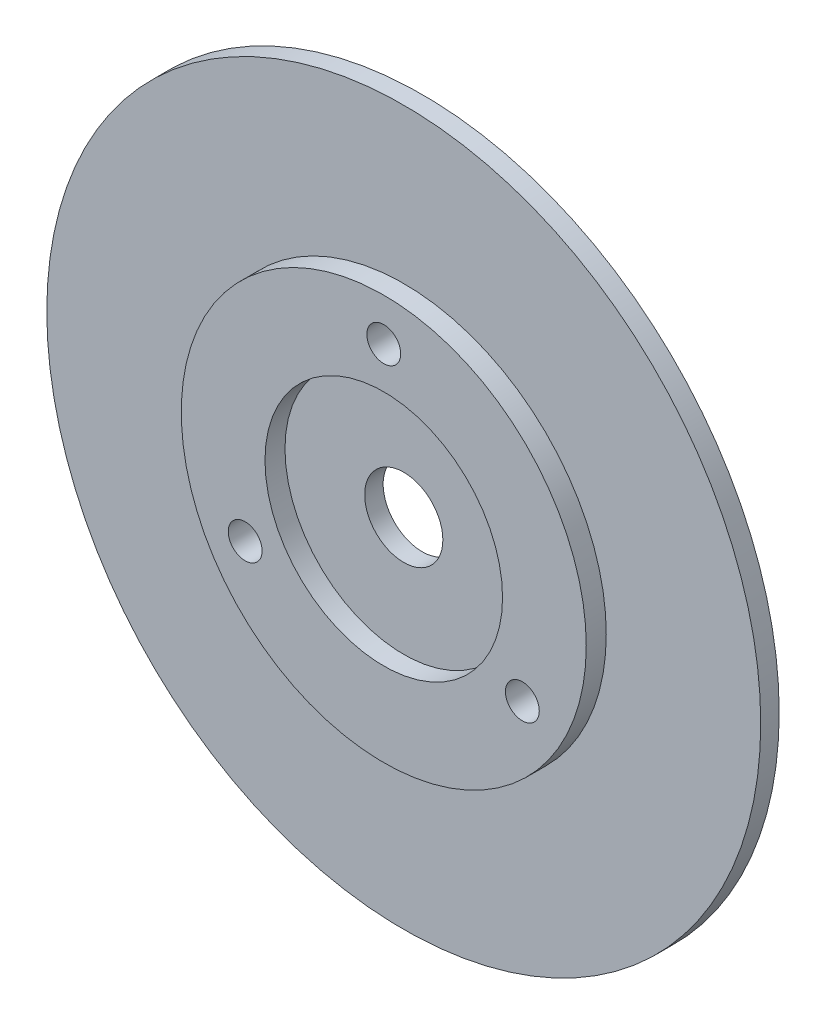
ISO-10303-21;
HEADER;
FILE_DESCRIPTION(('STEP AP214'),'2;1');
FILE_NAME('part.step','',(''),(''),'','','');
FILE_SCHEMA(('AUTOMOTIVE_DESIGN { 1 0 10303 214 1 1 1 1 }'));
ENDSEC;
DATA;
#1=APPLICATION_CONTEXT('core data for automotive mechanical design processes');
#2=APPLICATION_PROTOCOL_DEFINITION('international standard','automotive_design',2000,#1);
#3=PRODUCT_CONTEXT('',#1,'mechanical');
#4=PRODUCT('Part','Part','',(#3));
#5=PRODUCT_RELATED_PRODUCT_CATEGORY('part','',(#4));
#6=PRODUCT_DEFINITION_FORMATION('','',#4);
#7=PRODUCT_DEFINITION_CONTEXT('part definition',#1,'design');
#8=PRODUCT_DEFINITION('design','',#6,#7);
#9=PRODUCT_DEFINITION_SHAPE('','',#8);
#10=(LENGTH_UNIT() NAMED_UNIT(*) SI_UNIT(.MILLI.,.METRE.));
#11=(NAMED_UNIT(*) PLANE_ANGLE_UNIT() SI_UNIT($,.RADIAN.));
#12=(NAMED_UNIT(*) SI_UNIT($,.STERADIAN.) SOLID_ANGLE_UNIT());
#13=UNCERTAINTY_MEASURE_WITH_UNIT(LENGTH_MEASURE(1.E-05),#10,'distance_accuracy_value','');
#14=(GEOMETRIC_REPRESENTATION_CONTEXT(3) GLOBAL_UNCERTAINTY_ASSIGNED_CONTEXT((#13)) GLOBAL_UNIT_ASSIGNED_CONTEXT((#10,
#11,#12)) REPRESENTATION_CONTEXT('',''));
#15=CARTESIAN_POINT('',(0.,0.,0.));
#16=DIRECTION('',(0.,0.,1.));
#17=DIRECTION('',(1.,0.,0.));
#18=AXIS2_PLACEMENT_3D('',#15,#16,#17);
#19=CARTESIAN_POINT('',(0.,0.,0.));
#20=DIRECTION('',(0.,0.,1.));
#21=DIRECTION('',(1.,0.,0.));
#22=AXIS2_PLACEMENT_3D('',#19,#20,#21);
#23=CYLINDRICAL_SURFACE('',#22,6.35);
#24=CARTESIAN_POINT('',(0.,0.,0.));
#25=DIRECTION('',(0.,0.,1.));
#26=DIRECTION('',(1.,0.,0.));
#27=AXIS2_PLACEMENT_3D('',#24,#25,#26);
#28=CIRCLE('',#27,6.35);
#29=CARTESIAN_POINT('',(6.35,0.,0.));
#30=VERTEX_POINT('',#29);
#31=EDGE_CURVE('E69',#30,#30,#28,.T.);
#32=ORIENTED_EDGE('',*,*,#31,.T.);
#33=EDGE_LOOP('',(#32));
#34=FACE_BOUND('',#33,.T.);
#35=CARTESIAN_POINT('',(0.,0.,-3.));
#36=DIRECTION('',(0.,0.,1.));
#37=DIRECTION('',(1.,0.,0.));
#38=AXIS2_PLACEMENT_3D('',#35,#36,#37);
#39=CIRCLE('',#38,6.35);
#40=CARTESIAN_POINT('',(6.35,0.,-3.));
#41=VERTEX_POINT('',#40);
#42=EDGE_CURVE('E10',#41,#41,#39,.T.);
#43=ORIENTED_EDGE('',*,*,#42,.F.);
#44=EDGE_LOOP('',(#43));
#45=FACE_BOUND('',#44,.T.);
#46=ADVANCED_FACE('F41',(#34,#45),#23,.F.);
#47=CARTESIAN_POINT('',(6.35,0.,-3.));
#48=DIRECTION('',(0.,0.,-1.));
#49=DIRECTION('',(-1.,0.,0.));
#50=AXIS2_PLACEMENT_3D('',#47,#48,#49);
#51=PLANE('',#50);
#52=CARTESIAN_POINT('',(0.,26.,-3.));
#53=DIRECTION('',(0.,0.,1.));
#54=DIRECTION('',(1.,0.,0.));
#55=AXIS2_PLACEMENT_3D('',#52,#53,#54);
#56=CIRCLE('',#55,2.75);
#57=CARTESIAN_POINT('',(2.75,26.,-3.));
#58=VERTEX_POINT('',#57);
#59=EDGE_CURVE('E84',#58,#58,#56,.T.);
#60=ORIENTED_EDGE('',*,*,#59,.T.);
#61=EDGE_LOOP('',(#60));
#62=FACE_BOUND('',#61,.T.);
#63=CARTESIAN_POINT('',(-22.5166604983954,-13.,-3.));
#64=DIRECTION('',(0.,0.,1.));
#65=DIRECTION('',(1.,0.,0.));
#66=AXIS2_PLACEMENT_3D('',#63,#64,#65);
#67=CIRCLE('',#66,2.75);
#68=CARTESIAN_POINT('',(-19.7666604983954,-13.,-3.));
#69=VERTEX_POINT('',#68);
#70=EDGE_CURVE('E78',#69,#69,#67,.T.);
#71=ORIENTED_EDGE('',*,*,#70,.T.);
#72=EDGE_LOOP('',(#71));
#73=FACE_BOUND('',#72,.T.);
#74=CARTESIAN_POINT('',(22.5166604983954,-12.9999999999999,-3.));
#75=DIRECTION('',(0.,0.,1.));
#76=DIRECTION('',(1.,0.,0.));
#77=AXIS2_PLACEMENT_3D('',#74,#75,#76);
#78=CIRCLE('',#77,2.75);
#79=CARTESIAN_POINT('',(25.2666604983954,-12.9999999999999,-3.));
#80=VERTEX_POINT('',#79);
#81=EDGE_CURVE('E72',#80,#80,#78,.T.);
#82=ORIENTED_EDGE('',*,*,#81,.T.);
#83=EDGE_LOOP('',(#82));
#84=FACE_BOUND('',#83,.T.);
#85=ORIENTED_EDGE('',*,*,#42,.T.);
#86=EDGE_LOOP('',(#85));
#87=FACE_BOUND('',#86,.T.);
#88=CARTESIAN_POINT('',(0.,0.,-3.));
#89=DIRECTION('',(0.,0.,1.));
#90=DIRECTION('',(1.,0.,0.));
#91=AXIS2_PLACEMENT_3D('',#88,#89,#90);
#92=CIRCLE('',#91,58.);
#93=CARTESIAN_POINT('',(58.,0.,-3.));
#94=VERTEX_POINT('',#93);
#95=EDGE_CURVE('E47',#94,#94,#92,.T.);
#96=ORIENTED_EDGE('',*,*,#95,.F.);
#97=EDGE_LOOP('',(#96));
#98=FACE_BOUND('',#97,.T.);
#99=ADVANCED_FACE('F121',(#62,#73,#84,#87,#98),#51,.T.);
#100=CARTESIAN_POINT('',(0.,0.,0.));
#101=DIRECTION('',(0.,0.,1.));
#102=DIRECTION('',(1.,0.,0.));
#103=AXIS2_PLACEMENT_3D('',#100,#101,#102);
#104=CYLINDRICAL_SURFACE('',#103,58.);
#105=ORIENTED_EDGE('',*,*,#95,.T.);
#106=EDGE_LOOP('',(#105));
#107=FACE_BOUND('',#106,.T.);
#108=CARTESIAN_POINT('',(0.,0.,0.));
#109=DIRECTION('',(0.,0.,1.));
#110=DIRECTION('',(1.,0.,0.));
#111=AXIS2_PLACEMENT_3D('',#108,#109,#110);
#112=CIRCLE('',#111,58.);
#113=CARTESIAN_POINT('',(58.,0.,0.));
#114=VERTEX_POINT('',#113);
#115=EDGE_CURVE('E51',#114,#114,#112,.T.);
#116=ORIENTED_EDGE('',*,*,#115,.F.);
#117=EDGE_LOOP('',(#116));
#118=FACE_BOUND('',#117,.T.);
#119=ADVANCED_FACE('F126',(#107,#118),#104,.T.);
#120=CARTESIAN_POINT('',(32.9,0.,0.));
#121=DIRECTION('',(0.,0.,1.));
#122=DIRECTION('',(1.,0.,0.));
#123=AXIS2_PLACEMENT_3D('',#120,#121,#122);
#124=PLANE('',#123);
#125=ORIENTED_EDGE('',*,*,#115,.T.);
#126=EDGE_LOOP('',(#125));
#127=FACE_BOUND('',#126,.T.);
#128=CARTESIAN_POINT('',(0.,0.,0.));
#129=DIRECTION('',(0.,0.,1.));
#130=DIRECTION('',(1.,0.,0.));
#131=AXIS2_PLACEMENT_3D('',#128,#129,#130);
#132=CIRCLE('',#131,32.9);
#133=CARTESIAN_POINT('',(32.9,0.,0.));
#134=VERTEX_POINT('',#133);
#135=EDGE_CURVE('E55',#134,#134,#132,.T.);
#136=ORIENTED_EDGE('',*,*,#135,.F.);
#137=EDGE_LOOP('',(#136));
#138=FACE_BOUND('',#137,.T.);
#139=ADVANCED_FACE('F130',(#127,#138),#124,.T.);
#140=CARTESIAN_POINT('',(0.,0.,0.));
#141=DIRECTION('',(0.,0.,1.));
#142=DIRECTION('',(1.,0.,0.));
#143=AXIS2_PLACEMENT_3D('',#140,#141,#142);
#144=CYLINDRICAL_SURFACE('',#143,32.9);
#145=ORIENTED_EDGE('',*,*,#135,.T.);
#146=EDGE_LOOP('',(#145));
#147=FACE_BOUND('',#146,.T.);
#148=CARTESIAN_POINT('',(0.,0.,3.25));
#149=DIRECTION('',(0.,0.,1.));
#150=DIRECTION('',(1.,0.,0.));
#151=AXIS2_PLACEMENT_3D('',#148,#149,#150);
#152=CIRCLE('',#151,32.9);
#153=CARTESIAN_POINT('',(32.9,0.,3.25));
#154=VERTEX_POINT('',#153);
#155=EDGE_CURVE('E60',#154,#154,#152,.T.);
#156=ORIENTED_EDGE('',*,*,#155,.F.);
#157=EDGE_LOOP('',(#156));
#158=FACE_BOUND('',#157,.T.);
#159=ADVANCED_FACE('F97',(#147,#158),#144,.T.);
#160=CARTESIAN_POINT('',(19.3,0.,3.25));
#161=DIRECTION('',(0.,0.,1.));
#162=DIRECTION('',(1.,0.,0.));
#163=AXIS2_PLACEMENT_3D('',#160,#161,#162);
#164=PLANE('',#163);
#165=CARTESIAN_POINT('',(0.,26.,3.25));
#166=DIRECTION('',(0.,0.,1.));
#167=DIRECTION('',(1.,0.,0.));
#168=AXIS2_PLACEMENT_3D('',#165,#166,#167);
#169=CIRCLE('',#168,2.74999999999999);
#170=CARTESIAN_POINT('',(2.74999999999999,26.,3.25));
#171=VERTEX_POINT('',#170);
#172=EDGE_CURVE('E87',#171,#171,#169,.T.);
#173=ORIENTED_EDGE('',*,*,#172,.F.);
#174=EDGE_LOOP('',(#173));
#175=FACE_BOUND('',#174,.T.);
#176=CARTESIAN_POINT('',(-22.5166604983954,-13.,3.25));
#177=DIRECTION('',(0.,0.,1.));
#178=DIRECTION('',(1.,0.,0.));
#179=AXIS2_PLACEMENT_3D('',#176,#177,#178);
#180=CIRCLE('',#179,2.74999999999999);
#181=CARTESIAN_POINT('',(-19.7666604983954,-13.,3.25));
#182=VERTEX_POINT('',#181);
#183=EDGE_CURVE('E81',#182,#182,#180,.T.);
#184=ORIENTED_EDGE('',*,*,#183,.F.);
#185=EDGE_LOOP('',(#184));
#186=FACE_BOUND('',#185,.T.);
#187=CARTESIAN_POINT('',(22.5166604983954,-12.9999999999999,3.25));
#188=DIRECTION('',(0.,0.,1.));
#189=DIRECTION('',(1.,0.,0.));
#190=AXIS2_PLACEMENT_3D('',#187,#188,#189);
#191=CIRCLE('',#190,2.74999999999999);
#192=CARTESIAN_POINT('',(25.2666604983954,-12.9999999999999,3.25));
#193=VERTEX_POINT('',#192);
#194=EDGE_CURVE('E75',#193,#193,#191,.T.);
#195=ORIENTED_EDGE('',*,*,#194,.F.);
#196=EDGE_LOOP('',(#195));
#197=FACE_BOUND('',#196,.T.);
#198=ORIENTED_EDGE('',*,*,#155,.T.);
#199=EDGE_LOOP('',(#198));
#200=FACE_BOUND('',#199,.T.);
#201=CARTESIAN_POINT('',(0.,0.,3.25));
#202=DIRECTION('',(0.,0.,1.));
#203=DIRECTION('',(1.,0.,0.));
#204=AXIS2_PLACEMENT_3D('',#201,#202,#203);
#205=CIRCLE('',#204,19.3);
#206=CARTESIAN_POINT('',(19.3,0.,3.25));
#207=VERTEX_POINT('',#206);
#208=EDGE_CURVE('E63',#207,#207,#205,.T.);
#209=ORIENTED_EDGE('',*,*,#208,.F.);
#210=EDGE_LOOP('',(#209));
#211=FACE_BOUND('',#210,.T.);
#212=ADVANCED_FACE('F93',(#175,#186,#197,#200,#211),#164,.T.);
#213=CARTESIAN_POINT('',(0.,0.,0.));
#214=DIRECTION('',(0.,0.,1.));
#215=DIRECTION('',(1.,0.,0.));
#216=AXIS2_PLACEMENT_3D('',#213,#214,#215);
#217=CYLINDRICAL_SURFACE('',#216,19.3);
#218=ORIENTED_EDGE('',*,*,#208,.T.);
#219=EDGE_LOOP('',(#218));
#220=FACE_BOUND('',#219,.T.);
#221=CARTESIAN_POINT('',(0.,0.,0.));
#222=DIRECTION('',(0.,0.,1.));
#223=DIRECTION('',(1.,0.,0.));
#224=AXIS2_PLACEMENT_3D('',#221,#222,#223);
#225=CIRCLE('',#224,19.3);
#226=CARTESIAN_POINT('',(19.3,0.,0.));
#227=VERTEX_POINT('',#226);
#228=EDGE_CURVE('E66',#227,#227,#225,.T.);
#229=ORIENTED_EDGE('',*,*,#228,.F.);
#230=EDGE_LOOP('',(#229));
#231=FACE_BOUND('',#230,.T.);
#232=ADVANCED_FACE('F96',(#220,#231),#217,.F.);
#233=CARTESIAN_POINT('',(6.35,0.,0.));
#234=DIRECTION('',(0.,0.,1.));
#235=DIRECTION('',(1.,0.,0.));
#236=AXIS2_PLACEMENT_3D('',#233,#234,#235);
#237=PLANE('',#236);
#238=ORIENTED_EDGE('',*,*,#228,.T.);
#239=EDGE_LOOP('',(#238));
#240=FACE_BOUND('',#239,.T.);
#241=ORIENTED_EDGE('',*,*,#31,.F.);
#242=EDGE_LOOP('',(#241));
#243=FACE_BOUND('',#242,.T.);
#244=ADVANCED_FACE('F109',(#240,#243),#237,.T.);
#245=CARTESIAN_POINT('',(22.5166604983954,-12.9999999999999,3.25));
#246=DIRECTION('',(0.,0.,1.));
#247=DIRECTION('',(1.,0.,0.));
#248=AXIS2_PLACEMENT_3D('',#245,#246,#247);
#249=CYLINDRICAL_SURFACE('',#248,2.74999999999999);
#250=ORIENTED_EDGE('',*,*,#81,.F.);
#251=EDGE_LOOP('',(#250));
#252=FACE_BOUND('',#251,.T.);
#253=ORIENTED_EDGE('',*,*,#194,.T.);
#254=EDGE_LOOP('',(#253));
#255=FACE_BOUND('',#254,.T.);
#256=ADVANCED_FACE('F115',(#252,#255),#249,.F.);
#257=CARTESIAN_POINT('',(-22.5166604983954,-13.,3.25));
#258=DIRECTION('',(0.,0.,1.));
#259=DIRECTION('',(1.,0.,0.));
#260=AXIS2_PLACEMENT_3D('',#257,#258,#259);
#261=CYLINDRICAL_SURFACE('',#260,2.74999999999999);
#262=ORIENTED_EDGE('',*,*,#70,.F.);
#263=EDGE_LOOP('',(#262));
#264=FACE_BOUND('',#263,.T.);
#265=ORIENTED_EDGE('',*,*,#183,.T.);
#266=EDGE_LOOP('',(#265));
#267=FACE_BOUND('',#266,.T.);
#268=ADVANCED_FACE('F142',(#264,#267),#261,.F.);
#269=CARTESIAN_POINT('',(0.,26.,3.25));
#270=DIRECTION('',(0.,0.,1.));
#271=DIRECTION('',(1.,0.,0.));
#272=AXIS2_PLACEMENT_3D('',#269,#270,#271);
#273=CYLINDRICAL_SURFACE('',#272,2.74999999999999);
#274=ORIENTED_EDGE('',*,*,#59,.F.);
#275=EDGE_LOOP('',(#274));
#276=FACE_BOUND('',#275,.T.);
#277=ORIENTED_EDGE('',*,*,#172,.T.);
#278=EDGE_LOOP('',(#277));
#279=FACE_BOUND('',#278,.T.);
#280=ADVANCED_FACE('F91',(#276,#279),#273,.F.);
#281=CLOSED_SHELL('',(#46,#99,#119,#139,#159,#212,#232,#244,#256,#268,#280));
#282=MANIFOLD_SOLID_BREP('B2',#281);
#283=ADVANCED_BREP_SHAPE_REPRESENTATION('',(#18,#282),#14);
#284=SHAPE_DEFINITION_REPRESENTATION(#9,#283);
ENDSEC;
END-ISO-10303-21;
